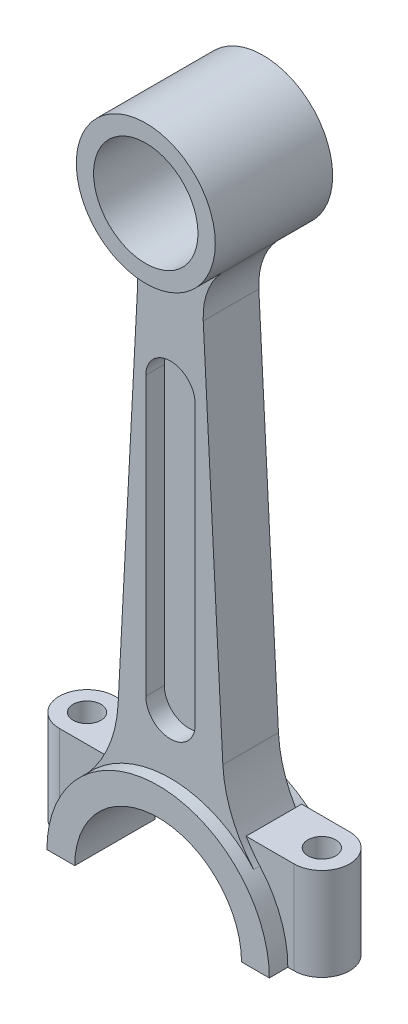
ISO-10303-21;
HEADER;
FILE_DESCRIPTION(('STEP AP214'),'2;1');
FILE_NAME('part.step','',(''),(''),'','','');
FILE_SCHEMA(('AUTOMOTIVE_DESIGN { 1 0 10303 214 1 1 1 1 }'));
ENDSEC;
DATA;
#1=APPLICATION_CONTEXT('core data for automotive mechanical design processes');
#2=APPLICATION_PROTOCOL_DEFINITION('international standard','automotive_design',2000,#1);
#3=PRODUCT_CONTEXT('',#1,'mechanical');
#4=PRODUCT('Part','Part','',(#3));
#5=PRODUCT_RELATED_PRODUCT_CATEGORY('part','',(#4));
#6=PRODUCT_DEFINITION_FORMATION('','',#4);
#7=PRODUCT_DEFINITION_CONTEXT('part definition',#1,'design');
#8=PRODUCT_DEFINITION('design','',#6,#7);
#9=PRODUCT_DEFINITION_SHAPE('','',#8);
#10=(LENGTH_UNIT() NAMED_UNIT(*) SI_UNIT(.MILLI.,.METRE.));
#11=(NAMED_UNIT(*) PLANE_ANGLE_UNIT() SI_UNIT($,.RADIAN.));
#12=(NAMED_UNIT(*) SI_UNIT($,.STERADIAN.) SOLID_ANGLE_UNIT());
#13=UNCERTAINTY_MEASURE_WITH_UNIT(LENGTH_MEASURE(1.E-05),#10,'distance_accuracy_value','');
#14=(GEOMETRIC_REPRESENTATION_CONTEXT(3) GLOBAL_UNCERTAINTY_ASSIGNED_CONTEXT((#13)) GLOBAL_UNIT_ASSIGNED_CONTEXT((#10,
#11,#12)) REPRESENTATION_CONTEXT('',''));
#15=CARTESIAN_POINT('',(0.,0.,0.));
#16=DIRECTION('',(0.,0.,1.));
#17=DIRECTION('',(1.,0.,0.));
#18=AXIS2_PLACEMENT_3D('',#15,#16,#17);
#19=CARTESIAN_POINT('',(0.,55.,-7.));
#20=DIRECTION('',(0.,0.,1.));
#21=DIRECTION('',(1.,0.,0.));
#22=AXIS2_PLACEMENT_3D('',#19,#20,#21);
#23=CYLINDRICAL_SURFACE('',#22,8.);
#24=CARTESIAN_POINT('',(0.,55.,-5.));
#25=DIRECTION('',(0.,0.,1.));
#26=DIRECTION('',(1.,0.,0.));
#27=AXIS2_PLACEMENT_3D('',#24,#25,#26);
#28=CIRCLE('',#27,8.);
#29=CARTESIAN_POINT('',(-7.99999999999999,55.,-5.));
#30=VERTEX_POINT('',#29);
#31=CARTESIAN_POINT('',(8.00000000000001,55.,-5.));
#32=VERTEX_POINT('',#31);
#33=EDGE_CURVE('E55',#30,#32,#28,.T.);
#34=ORIENTED_EDGE('',*,*,#33,.T.);
#35=DIRECTION('',(0.,0.,1.));
#36=VECTOR('',#35,1.);
#37=CARTESIAN_POINT('',(8.00000000000001,55.,-7.));
#38=LINE('',#37,#36);
#39=CARTESIAN_POINT('',(8.00000000000001,55.,-7.));
#40=VERTEX_POINT('',#39);
#41=EDGE_CURVE('E376',#40,#32,#38,.T.);
#42=ORIENTED_EDGE('',*,*,#41,.F.);
#43=CARTESIAN_POINT('',(0.,55.,-7.));
#44=DIRECTION('',(0.,0.,1.));
#45=DIRECTION('',(1.,0.,0.));
#46=AXIS2_PLACEMENT_3D('',#43,#44,#45);
#47=CIRCLE('',#46,8.);
#48=CARTESIAN_POINT('',(-7.99999999999999,55.,-7.));
#49=VERTEX_POINT('',#48);
#50=EDGE_CURVE('E411',#49,#40,#47,.T.);
#51=ORIENTED_EDGE('',*,*,#50,.F.);
#52=DIRECTION('',(0.,0.,1.));
#53=VECTOR('',#52,1.);
#54=CARTESIAN_POINT('',(-7.99999999999999,55.,-7.));
#55=LINE('',#54,#53);
#56=EDGE_CURVE('E269',#49,#30,#55,.T.);
#57=ORIENTED_EDGE('',*,*,#56,.T.);
#58=EDGE_LOOP('',(#34,#42,#51,#57));
#59=FACE_BOUND('',#58,.T.);
#60=ADVANCED_FACE('F40',(#59),#23,.F.);
#61=CARTESIAN_POINT('',(8.00000000000002,0.,-7.));
#62=DIRECTION('',(-1.,0.,0.));
#63=DIRECTION('',(0.,-1.,0.));
#64=AXIS2_PLACEMENT_3D('',#61,#62,#63);
#65=PLANE('',#64);
#66=ORIENTED_EDGE('',*,*,#41,.T.);
#67=DIRECTION('',(0.,-1.,0.));
#68=VECTOR('',#67,1.);
#69=CARTESIAN_POINT('',(8.00000000000002,0.,-5.));
#70=LINE('',#69,#68);
#71=CARTESIAN_POINT('',(8.,145.,-5.));
#72=VERTEX_POINT('',#71);
#73=EDGE_CURVE('E62',#72,#32,#70,.T.);
#74=ORIENTED_EDGE('',*,*,#73,.F.);
#75=DIRECTION('',(0.,0.,1.));
#76=VECTOR('',#75,1.);
#77=CARTESIAN_POINT('',(8.,145.,-7.));
#78=LINE('',#77,#76);
#79=CARTESIAN_POINT('',(8.,145.,-7.));
#80=VERTEX_POINT('',#79);
#81=EDGE_CURVE('E377',#80,#72,#78,.T.);
#82=ORIENTED_EDGE('',*,*,#81,.F.);
#83=DIRECTION('',(0.,-1.,0.));
#84=VECTOR('',#83,1.);
#85=CARTESIAN_POINT('',(8.00000000000002,0.,-7.));
#86=LINE('',#85,#84);
#87=EDGE_CURVE('E354',#80,#40,#86,.T.);
#88=ORIENTED_EDGE('',*,*,#87,.T.);
#89=EDGE_LOOP('',(#66,#74,#82,#88));
#90=FACE_BOUND('',#89,.T.);
#91=ADVANCED_FACE('F422',(#90),#65,.T.);
#92=CARTESIAN_POINT('',(0.,145.,-7.));
#93=DIRECTION('',(0.,0.,1.));
#94=DIRECTION('',(1.,0.,0.));
#95=AXIS2_PLACEMENT_3D('',#92,#93,#94);
#96=CYLINDRICAL_SURFACE('',#95,8.);
#97=CARTESIAN_POINT('',(0.,145.,-5.));
#98=DIRECTION('',(0.,0.,1.));
#99=DIRECTION('',(1.,0.,0.));
#100=AXIS2_PLACEMENT_3D('',#97,#98,#99);
#101=CIRCLE('',#100,8.);
#102=CARTESIAN_POINT('',(-8.,145.,-5.));
#103=VERTEX_POINT('',#102);
#104=EDGE_CURVE('E254',#72,#103,#101,.T.);
#105=ORIENTED_EDGE('',*,*,#104,.T.);
#106=DIRECTION('',(0.,0.,1.));
#107=VECTOR('',#106,1.);
#108=CARTESIAN_POINT('',(-8.,145.,-7.));
#109=LINE('',#108,#107);
#110=CARTESIAN_POINT('',(-8.,145.,-7.));
#111=VERTEX_POINT('',#110);
#112=EDGE_CURVE('E277',#111,#103,#109,.T.);
#113=ORIENTED_EDGE('',*,*,#112,.F.);
#114=CARTESIAN_POINT('',(0.,145.,-7.));
#115=DIRECTION('',(0.,0.,1.));
#116=DIRECTION('',(1.,0.,0.));
#117=AXIS2_PLACEMENT_3D('',#114,#115,#116);
#118=CIRCLE('',#117,8.);
#119=EDGE_CURVE('E359',#80,#111,#118,.T.);
#120=ORIENTED_EDGE('',*,*,#119,.F.);
#121=ORIENTED_EDGE('',*,*,#81,.T.);
#122=EDGE_LOOP('',(#105,#113,#120,#121));
#123=FACE_BOUND('',#122,.T.);
#124=ADVANCED_FACE('F417',(#123),#96,.F.);
#125=CARTESIAN_POINT('',(-7.99999999999999,0.,-7.));
#126=DIRECTION('',(-1.,0.,0.));
#127=DIRECTION('',(0.,-1.,0.));
#128=AXIS2_PLACEMENT_3D('',#125,#126,#127);
#129=PLANE('',#128);
#130=DIRECTION('',(0.,-1.,0.));
#131=VECTOR('',#130,1.);
#132=CARTESIAN_POINT('',(-7.99999999999999,0.,-5.));
#133=LINE('',#132,#131);
#134=EDGE_CURVE('E421',#103,#30,#133,.T.);
#135=ORIENTED_EDGE('',*,*,#134,.T.);
#136=ORIENTED_EDGE('',*,*,#56,.F.);
#137=DIRECTION('',(0.,-1.,0.));
#138=VECTOR('',#137,1.);
#139=CARTESIAN_POINT('',(-7.99999999999999,0.,-7.));
#140=LINE('',#139,#138);
#141=EDGE_CURVE('E413',#111,#49,#140,.T.);
#142=ORIENTED_EDGE('',*,*,#141,.F.);
#143=ORIENTED_EDGE('',*,*,#112,.T.);
#144=EDGE_LOOP('',(#135,#136,#142,#143));
#145=FACE_BOUND('',#144,.T.);
#146=ADVANCED_FACE('F419',(#145),#129,.F.);
#147=CARTESIAN_POINT('',(-38.,30.,0.));
#148=DIRECTION('',(0.,1.,0.));
#149=DIRECTION('',(0.,0.,1.));
#150=AXIS2_PLACEMENT_3D('',#147,#148,#149);
#151=CYLINDRICAL_SURFACE('',#150,9.);
#152=DIRECTION('',(0.,1.,0.));
#153=VECTOR('',#152,1.);
#154=CARTESIAN_POINT('',(-38.,0.,9.));
#155=LINE('',#154,#153);
#156=CARTESIAN_POINT('',(-38.,30.,9.));
#157=VERTEX_POINT('',#156);
#158=CARTESIAN_POINT('',(-38.,0.,9.));
#159=VERTEX_POINT('',#158);
#160=EDGE_CURVE('E302',#157,#159,#155,.F.);
#161=ORIENTED_EDGE('',*,*,#160,.F.);
#162=CARTESIAN_POINT('',(-38.,30.,0.));
#163=DIRECTION('',(0.,1.,0.));
#164=DIRECTION('',(0.,0.,1.));
#165=AXIS2_PLACEMENT_3D('',#162,#163,#164);
#166=CIRCLE('',#165,9.);
#167=CARTESIAN_POINT('',(-38.,30.,-9.));
#168=VERTEX_POINT('',#167);
#169=EDGE_CURVE('E308',#168,#157,#166,.T.);
#170=ORIENTED_EDGE('',*,*,#169,.F.);
#171=DIRECTION('',(0.,-1.,0.));
#172=VECTOR('',#171,1.);
#173=CARTESIAN_POINT('',(-38.,30.,-9.));
#174=LINE('',#173,#172);
#175=CARTESIAN_POINT('',(-38.,0.,-9.));
#176=VERTEX_POINT('',#175);
#177=EDGE_CURVE('E305',#176,#168,#174,.F.);
#178=ORIENTED_EDGE('',*,*,#177,.F.);
#179=CARTESIAN_POINT('',(-38.,0.,0.));
#180=DIRECTION('',(0.,-1.,0.));
#181=DIRECTION('',(0.,0.,-1.));
#182=AXIS2_PLACEMENT_3D('',#179,#180,#181);
#183=CIRCLE('',#182,9.);
#184=EDGE_CURVE('E310',#159,#176,#183,.T.);
#185=ORIENTED_EDGE('',*,*,#184,.F.);
#186=EDGE_LOOP('',(#161,#170,#178,#185));
#187=FACE_BOUND('',#186,.T.);
#188=ADVANCED_FACE('F578',(#187),#151,.T.);
#189=CARTESIAN_POINT('',(38.,30.,0.));
#190=DIRECTION('',(0.,1.,0.));
#191=DIRECTION('',(0.,0.,1.));
#192=AXIS2_PLACEMENT_3D('',#189,#190,#191);
#193=CYLINDRICAL_SURFACE('',#192,9.);
#194=DIRECTION('',(0.,1.,0.));
#195=VECTOR('',#194,1.);
#196=CARTESIAN_POINT('',(38.,0.,-9.));
#197=LINE('',#196,#195);
#198=CARTESIAN_POINT('',(38.,30.,-9.));
#199=VERTEX_POINT('',#198);
#200=CARTESIAN_POINT('',(38.,0.,-9.));
#201=VERTEX_POINT('',#200);
#202=EDGE_CURVE('E286',#199,#201,#197,.F.);
#203=ORIENTED_EDGE('',*,*,#202,.F.);
#204=CARTESIAN_POINT('',(38.,30.,0.));
#205=DIRECTION('',(0.,-1.,0.));
#206=DIRECTION('',(1.,0.,0.));
#207=AXIS2_PLACEMENT_3D('',#204,#205,#206);
#208=CIRCLE('',#207,9.);
#209=CARTESIAN_POINT('',(38.,30.,9.));
#210=VERTEX_POINT('',#209);
#211=EDGE_CURVE('E298',#210,#199,#208,.F.);
#212=ORIENTED_EDGE('',*,*,#211,.F.);
#213=DIRECTION('',(0.,-1.,0.));
#214=VECTOR('',#213,1.);
#215=CARTESIAN_POINT('',(38.,30.,9.));
#216=LINE('',#215,#214);
#217=CARTESIAN_POINT('',(38.,0.,9.));
#218=VERTEX_POINT('',#217);
#219=EDGE_CURVE('E295',#218,#210,#216,.F.);
#220=ORIENTED_EDGE('',*,*,#219,.F.);
#221=CARTESIAN_POINT('',(38.,0.,0.));
#222=DIRECTION('',(0.,-1.,0.));
#223=DIRECTION('',(0.,0.,-1.));
#224=AXIS2_PLACEMENT_3D('',#221,#222,#223);
#225=CIRCLE('',#224,9.);
#226=EDGE_CURVE('E300',#201,#218,#225,.T.);
#227=ORIENTED_EDGE('',*,*,#226,.F.);
#228=EDGE_LOOP('',(#203,#212,#220,#227));
#229=FACE_BOUND('',#228,.T.);
#230=ADVANCED_FACE('F632',(#229),#193,.T.);
#231=CARTESIAN_POINT('',(56.9027580616712,50.379322394956,-7.));
#232=DIRECTION('',(0.,0.,1.));
#233=DIRECTION('',(1.,0.,0.));
#234=AXIS2_PLACEMENT_3D('',#231,#232,#233);
#235=CYLINDRICAL_SURFACE('',#234,40.);
#236=DIRECTION('',(0.,0.,-1.));
#237=VECTOR('',#236,1.);
#238=CARTESIAN_POINT('',(22.4835306048783,30.,9.));
#239=LINE('',#238,#237);
#240=CARTESIAN_POINT('',(22.4835306048783,30.,9.));
#241=VERTEX_POINT('',#240);
#242=CARTESIAN_POINT('',(22.4835306048783,30.,-7.));
#243=VERTEX_POINT('',#242);
#244=EDGE_CURVE('E483',#241,#243,#239,.T.);
#245=ORIENTED_EDGE('',*,*,#244,.T.);
#246=CARTESIAN_POINT('',(56.9027580616712,50.379322394956,-7.));
#247=DIRECTION('',(0.,0.,1.));
#248=DIRECTION('',(1.,0.,0.));
#249=AXIS2_PLACEMENT_3D('',#246,#247,#248);
#250=CIRCLE('',#249,40.);
#251=CARTESIAN_POINT('',(16.9575766714883,48.2858841452382,-7.));
#252=VERTEX_POINT('',#251);
#253=EDGE_CURVE('E365',#252,#243,#250,.T.);
#254=ORIENTED_EDGE('',*,*,#253,.F.);
#255=DIRECTION('',(0.,0.,1.));
#256=VECTOR('',#255,1.);
#257=CARTESIAN_POINT('',(16.9575766714883,48.2858841452382,-7.));
#258=LINE('',#257,#256);
#259=CARTESIAN_POINT('',(16.9575766714883,48.2858841452382,11.));
#260=VERTEX_POINT('',#259);
#261=EDGE_CURVE('E290',#252,#260,#258,.T.);
#262=ORIENTED_EDGE('',*,*,#261,.T.);
#263=CARTESIAN_POINT('',(56.9027580616712,50.379322394956,11.));
#264=DIRECTION('',(0.,0.,1.));
#265=DIRECTION('',(1.,0.,0.));
#266=AXIS2_PLACEMENT_3D('',#263,#264,#265);
#267=CIRCLE('',#266,40.);
#268=CARTESIAN_POINT('',(26.9539380292127,23.8638895555055,11.));
#269=VERTEX_POINT('',#268);
#270=EDGE_CURVE('E405',#260,#269,#267,.T.);
#271=ORIENTED_EDGE('',*,*,#270,.T.);
#272=DIRECTION('',(0.,0.,1.));
#273=VECTOR('',#272,1.);
#274=CARTESIAN_POINT('',(26.9539380292127,23.8638895555055,-7.));
#275=LINE('',#274,#273);
#276=CARTESIAN_POINT('',(26.9539380292127,23.8638895555055,9.));
#277=VERTEX_POINT('',#276);
#278=EDGE_CURVE('E371',#277,#269,#275,.T.);
#279=ORIENTED_EDGE('',*,*,#278,.F.);
#280=CARTESIAN_POINT('',(56.9027580616712,50.379322394956,9.));
#281=DIRECTION('',(0.,0.,1.));
#282=DIRECTION('',(1.,0.,0.));
#283=AXIS2_PLACEMENT_3D('',#280,#281,#282);
#284=CIRCLE('',#283,40.);
#285=EDGE_CURVE('E462',#241,#277,#284,.T.);
#286=ORIENTED_EDGE('',*,*,#285,.F.);
#287=EDGE_LOOP('',(#245,#254,#262,#271,#279,#286));
#288=FACE_BOUND('',#287,.T.);
#289=ADVANCED_FACE('F601',(#288),#235,.F.);
#290=CARTESIAN_POINT('',(0.,0.,-11.));
#291=DIRECTION('',(0.,0.,1.));
#292=DIRECTION('',(1.,0.,0.));
#293=AXIS2_PLACEMENT_3D('',#290,#291,#292);
#294=CYLINDRICAL_SURFACE('',#293,36.);
#295=CARTESIAN_POINT('',(0.,0.,-7.));
#296=DIRECTION('',(0.,0.,1.));
#297=DIRECTION('',(1.,0.,0.));
#298=AXIS2_PLACEMENT_3D('',#295,#296,#297);
#299=CIRCLE('',#298,36.);
#300=CARTESIAN_POINT('',(26.9539380292127,23.8638895555055,-7.));
#301=VERTEX_POINT('',#300);
#302=CARTESIAN_POINT('',(-26.9539380292127,23.8638895555054,-7.));
#303=VERTEX_POINT('',#302);
#304=EDGE_CURVE('E356',#301,#303,#299,.T.);
#305=ORIENTED_EDGE('',*,*,#304,.F.);
#306=DIRECTION('',(0.,0.,-1.));
#307=VECTOR('',#306,1.);
#308=CARTESIAN_POINT('',(26.9539380292127,23.8638895555055,9.));
#309=LINE('',#308,#307);
#310=CARTESIAN_POINT('',(26.9539380292127,23.8638895555055,-9.));
#311=VERTEX_POINT('',#310);
#312=EDGE_CURVE('E471',#301,#311,#309,.T.);
#313=ORIENTED_EDGE('',*,*,#312,.T.);
#314=CARTESIAN_POINT('',(0.,0.,-9.));
#315=DIRECTION('',(0.,0.,1.));
#316=DIRECTION('',(1.,0.,0.));
#317=AXIS2_PLACEMENT_3D('',#314,#315,#316);
#318=CIRCLE('',#317,36.);
#319=CARTESIAN_POINT('',(36.,0.,-9.));
#320=VERTEX_POINT('',#319);
#321=EDGE_CURVE('E475',#320,#311,#318,.T.);
#322=ORIENTED_EDGE('',*,*,#321,.F.);
#323=DIRECTION('',(0.,0.,1.));
#324=VECTOR('',#323,1.);
#325=CARTESIAN_POINT('',(36.,0.,-11.));
#326=LINE('',#325,#324);
#327=CARTESIAN_POINT('',(36.,0.,-11.));
#328=VERTEX_POINT('',#327);
#329=EDGE_CURVE('E542',#328,#320,#326,.T.);
#330=ORIENTED_EDGE('',*,*,#329,.F.);
#331=CARTESIAN_POINT('',(0.,0.,-11.));
#332=DIRECTION('',(0.,0.,1.));
#333=DIRECTION('',(1.,0.,0.));
#334=AXIS2_PLACEMENT_3D('',#331,#332,#333);
#335=CIRCLE('',#334,36.);
#336=CARTESIAN_POINT('',(-36.,0.,-11.));
#337=VERTEX_POINT('',#336);
#338=EDGE_CURVE('E533',#328,#337,#335,.T.);
#339=ORIENTED_EDGE('',*,*,#338,.T.);
#340=DIRECTION('',(0.,0.,1.));
#341=VECTOR('',#340,1.);
#342=CARTESIAN_POINT('',(-36.,0.,-11.));
#343=LINE('',#342,#341);
#344=CARTESIAN_POINT('',(-36.,0.,-9.));
#345=VERTEX_POINT('',#344);
#346=EDGE_CURVE('E539',#337,#345,#343,.T.);
#347=ORIENTED_EDGE('',*,*,#346,.T.);
#348=CARTESIAN_POINT('',(0.,0.,-9.));
#349=DIRECTION('',(0.,0.,1.));
#350=DIRECTION('',(1.,0.,0.));
#351=AXIS2_PLACEMENT_3D('',#348,#349,#350);
#352=CIRCLE('',#351,36.);
#353=CARTESIAN_POINT('',(-26.9539380292127,23.8638895555054,-9.));
#354=VERTEX_POINT('',#353);
#355=EDGE_CURVE('E492',#354,#345,#352,.T.);
#356=ORIENTED_EDGE('',*,*,#355,.F.);
#357=DIRECTION('',(0.,0.,-1.));
#358=VECTOR('',#357,1.);
#359=CARTESIAN_POINT('',(-26.9539380292127,23.8638895555054,9.));
#360=LINE('',#359,#358);
#361=EDGE_CURVE('E500',#303,#354,#360,.T.);
#362=ORIENTED_EDGE('',*,*,#361,.F.);
#363=EDGE_LOOP('',(#305,#313,#322,#330,#339,#347,#356,#362));
#364=FACE_BOUND('',#363,.T.);
#365=ADVANCED_FACE('F585',(#364),#294,.T.);
#366=CARTESIAN_POINT('',(0.,201.2,19.));
#367=DIRECTION('',(0.,0.,-1.));
#368=DIRECTION('',(-1.,0.,0.));
#369=AXIS2_PLACEMENT_3D('',#366,#367,#368);
#370=CYLINDRICAL_SURFACE('',#369,22.5);
#371=CARTESIAN_POINT('',(0.,201.2,-19.));
#372=DIRECTION('',(0.,0.,1.));
#373=DIRECTION('',(1.,0.,0.));
#374=AXIS2_PLACEMENT_3D('',#371,#372,#373);
#375=CIRCLE('',#374,22.5);
#376=CARTESIAN_POINT('',(22.5,201.2,-19.));
#377=VERTEX_POINT('',#376);
#378=EDGE_CURVE('E283',#377,#377,#375,.T.);
#379=ORIENTED_EDGE('',*,*,#378,.T.);
#380=EDGE_LOOP('',(#379));
#381=FACE_BOUND('',#380,.T.);
#382=CARTESIAN_POINT('',(0.,201.2,19.));
#383=DIRECTION('',(0.,0.,1.));
#384=DIRECTION('',(1.,0.,0.));
#385=AXIS2_PLACEMENT_3D('',#382,#383,#384);
#386=CIRCLE('',#385,22.5);
#387=CARTESIAN_POINT('',(22.5,201.2,19.));
#388=VERTEX_POINT('',#387);
#389=EDGE_CURVE('E282',#388,#388,#386,.T.);
#390=ORIENTED_EDGE('',*,*,#389,.F.);
#391=EDGE_LOOP('',(#390));
#392=FACE_BOUND('',#391,.T.);
#393=CARTESIAN_POINT('',(0.,201.2,11.));
#394=DIRECTION('',(0.,0.,1.));
#395=DIRECTION('',(1.,0.,0.));
#396=AXIS2_PLACEMENT_3D('',#393,#394,#395);
#397=CIRCLE('',#396,22.5);
#398=CARTESIAN_POINT('',(-16.5368777609888,185.942815662183,11.));
#399=VERTEX_POINT('',#398);
#400=CARTESIAN_POINT('',(16.5368777609888,185.942815662183,11.));
#401=VERTEX_POINT('',#400);
#402=EDGE_CURVE('E334',#399,#401,#397,.T.);
#403=ORIENTED_EDGE('',*,*,#402,.T.);
#404=DIRECTION('',(0.,0.,-1.));
#405=VECTOR('',#404,1.);
#406=CARTESIAN_POINT('',(16.5368777609888,185.942815662183,19.));
#407=LINE('',#406,#405);
#408=CARTESIAN_POINT('',(16.5368777609888,185.942815662183,-7.));
#409=VERTEX_POINT('',#408);
#410=EDGE_CURVE('E318',#401,#409,#407,.T.);
#411=ORIENTED_EDGE('',*,*,#410,.T.);
#412=CARTESIAN_POINT('',(0.,201.2,-7.));
#413=DIRECTION('',(0.,0.,1.));
#414=DIRECTION('',(1.,0.,0.));
#415=AXIS2_PLACEMENT_3D('',#412,#413,#414);
#416=CIRCLE('',#415,22.5);
#417=CARTESIAN_POINT('',(-16.5368777609888,185.942815662183,-7.));
#418=VERTEX_POINT('',#417);
#419=EDGE_CURVE('E270',#418,#409,#416,.T.);
#420=ORIENTED_EDGE('',*,*,#419,.F.);
#421=DIRECTION('',(0.,0.,-1.));
#422=VECTOR('',#421,1.);
#423=CARTESIAN_POINT('',(-16.5368777609888,185.942815662183,19.));
#424=LINE('',#423,#422);
#425=EDGE_CURVE('E315',#418,#399,#424,.F.);
#426=ORIENTED_EDGE('',*,*,#425,.T.);
#427=EDGE_LOOP('',(#403,#411,#420,#426));
#428=FACE_BOUND('',#427,.T.);
#429=ADVANCED_FACE('F613',(#381,#392,#428),#370,.T.);
#430=CARTESIAN_POINT('',(0.,201.2,19.));
#431=DIRECTION('',(0.,0.,-1.));
#432=DIRECTION('',(-1.,0.,0.));
#433=AXIS2_PLACEMENT_3D('',#430,#431,#432);
#434=CYLINDRICAL_SURFACE('',#433,16.9);
#435=CARTESIAN_POINT('',(0.,201.2,19.));
#436=DIRECTION('',(0.,0.,1.));
#437=DIRECTION('',(1.,0.,0.));
#438=AXIS2_PLACEMENT_3D('',#435,#436,#437);
#439=CIRCLE('',#438,16.9);
#440=CARTESIAN_POINT('',(16.9,201.2,19.));
#441=VERTEX_POINT('',#440);
#442=EDGE_CURVE('E279',#441,#441,#439,.T.);
#443=ORIENTED_EDGE('',*,*,#442,.T.);
#444=EDGE_LOOP('',(#443));
#445=FACE_BOUND('',#444,.T.);
#446=CARTESIAN_POINT('',(0.,201.2,-19.));
#447=DIRECTION('',(0.,0.,1.));
#448=DIRECTION('',(1.,0.,0.));
#449=AXIS2_PLACEMENT_3D('',#446,#447,#448);
#450=CIRCLE('',#449,16.9);
#451=CARTESIAN_POINT('',(16.9,201.2,-19.));
#452=VERTEX_POINT('',#451);
#453=EDGE_CURVE('E287',#452,#452,#450,.T.);
#454=ORIENTED_EDGE('',*,*,#453,.F.);
#455=EDGE_LOOP('',(#454));
#456=FACE_BOUND('',#455,.T.);
#457=ADVANCED_FACE('F615',(#445,#456),#434,.F.);
#458=CARTESIAN_POINT('',(0.,0.,19.));
#459=DIRECTION('',(0.,0.,1.));
#460=DIRECTION('',(1.,0.,0.));
#461=AXIS2_PLACEMENT_3D('',#458,#459,#460);
#462=PLANE('',#461);
#463=ORIENTED_EDGE('',*,*,#442,.F.);
#464=EDGE_LOOP('',(#463));
#465=FACE_BOUND('',#464,.T.);
#466=ORIENTED_EDGE('',*,*,#389,.T.);
#467=EDGE_LOOP('',(#466));
#468=FACE_BOUND('',#467,.T.);
#469=ADVANCED_FACE('F622',(#465,#468),#462,.T.);
#470=CARTESIAN_POINT('',(0.,0.,-19.));
#471=DIRECTION('',(0.,0.,1.));
#472=DIRECTION('',(1.,0.,0.));
#473=AXIS2_PLACEMENT_3D('',#470,#471,#472);
#474=PLANE('',#473);
#475=ORIENTED_EDGE('',*,*,#453,.T.);
#476=EDGE_LOOP('',(#475));
#477=FACE_BOUND('',#476,.T.);
#478=ORIENTED_EDGE('',*,*,#378,.F.);
#479=EDGE_LOOP('',(#478));
#480=FACE_BOUND('',#479,.T.);
#481=ADVANCED_FACE('F628',(#477,#480),#474,.F.);
#482=CARTESIAN_POINT('',(-19.4347536154456,1.01853227789856,-7.));
#483=DIRECTION('',(-0.998629534754574,0.0523359562429438,0.));
#484=DIRECTION('',(-0.0523359562429438,-0.998629534754574,0.));
#485=AXIS2_PLACEMENT_3D('',#482,#483,#484);
#486=PLANE('',#485);
#487=DIRECTION('',(-0.0523359562429438,-0.998629534754574,0.));
#488=VECTOR('',#487,1.);
#489=CARTESIAN_POINT('',(-19.4347536154456,1.01853227789856,11.));
#490=LINE('',#489,#488);
#491=CARTESIAN_POINT('',(-10.6045909899997,169.508072308901,11.));
#492=VERTEX_POINT('',#491);
#493=CARTESIAN_POINT('',(-16.9575766714882,48.2858841452382,11.));
#494=VERTEX_POINT('',#493);
#495=EDGE_CURVE('E332',#492,#494,#490,.T.);
#496=ORIENTED_EDGE('',*,*,#495,.F.);
#497=DIRECTION('',(0.,0.,-1.));
#498=VECTOR('',#497,1.);
#499=CARTESIAN_POINT('',(-10.6045909899997,169.508072308901,-7.));
#500=LINE('',#499,#498);
#501=CARTESIAN_POINT('',(-10.6045909899997,169.508072308901,-7.));
#502=VERTEX_POINT('',#501);
#503=EDGE_CURVE('E321',#492,#502,#500,.T.);
#504=ORIENTED_EDGE('',*,*,#503,.T.);
#505=DIRECTION('',(-0.0523359562429438,-0.998629534754574,0.));
#506=VECTOR('',#505,1.);
#507=CARTESIAN_POINT('',(-19.4347536154456,1.01853227789856,-7.));
#508=LINE('',#507,#506);
#509=CARTESIAN_POINT('',(-16.9575766714882,48.2858841452382,-7.));
#510=VERTEX_POINT('',#509);
#511=EDGE_CURVE('E351',#502,#510,#508,.T.);
#512=ORIENTED_EDGE('',*,*,#511,.T.);
#513=DIRECTION('',(0.,0.,1.));
#514=VECTOR('',#513,1.);
#515=CARTESIAN_POINT('',(-16.9575766714882,48.2858841452382,-7.));
#516=LINE('',#515,#514);
#517=EDGE_CURVE('E342',#510,#494,#516,.T.);
#518=ORIENTED_EDGE('',*,*,#517,.T.);
#519=EDGE_LOOP('',(#496,#504,#512,#518));
#520=FACE_BOUND('',#519,.T.);
#521=ADVANCED_FACE('F339',(#520),#486,.T.);
#522=CARTESIAN_POINT('',(19.4347536154457,1.01853227789857,-7.));
#523=DIRECTION('',(-0.998629534754574,-0.0523359562429444,0.));
#524=DIRECTION('',(0.0523359562429444,-0.998629534754574,0.));
#525=AXIS2_PLACEMENT_3D('',#522,#523,#524);
#526=PLANE('',#525);
#527=DIRECTION('',(0.0523359562429444,-0.998629534754574,0.));
#528=VECTOR('',#527,1.);
#529=CARTESIAN_POINT('',(19.4347536154457,1.01853227789857,-7.));
#530=LINE('',#529,#528);
#531=CARTESIAN_POINT('',(10.6045909899997,169.508072308901,-7.));
#532=VERTEX_POINT('',#531);
#533=EDGE_CURVE('E273',#532,#252,#530,.T.);
#534=ORIENTED_EDGE('',*,*,#533,.F.);
#535=DIRECTION('',(0.,0.,1.));
#536=VECTOR('',#535,1.);
#537=CARTESIAN_POINT('',(10.6045909899997,169.508072308901,11.));
#538=LINE('',#537,#536);
#539=CARTESIAN_POINT('',(10.6045909899997,169.508072308901,11.));
#540=VERTEX_POINT('',#539);
#541=EDGE_CURVE('E312',#532,#540,#538,.T.);
#542=ORIENTED_EDGE('',*,*,#541,.T.);
#543=DIRECTION('',(0.0523359562429444,-0.998629534754574,0.));
#544=VECTOR('',#543,1.);
#545=CARTESIAN_POINT('',(19.4347536154457,1.01853227789857,11.));
#546=LINE('',#545,#544);
#547=EDGE_CURVE('E408',#540,#260,#546,.T.);
#548=ORIENTED_EDGE('',*,*,#547,.T.);
#549=ORIENTED_EDGE('',*,*,#261,.F.);
#550=EDGE_LOOP('',(#534,#542,#548,#549));
#551=FACE_BOUND('',#550,.T.);
#552=ADVANCED_FACE('F439',(#551),#526,.F.);
#553=CARTESIAN_POINT('',(8.00000000000001,55.,5.));
#554=VERTEX_POINT('',#553);
#555=CARTESIAN_POINT('',(8.00000000000001,55.,11.));
#556=VERTEX_POINT('',#555);
#557=EDGE_CURVE('E262',#554,#556,#38,.T.);
#558=ORIENTED_EDGE('',*,*,#557,.F.);
#559=CARTESIAN_POINT('',(0.,55.,5.));
#560=DIRECTION('',(0.,0.,1.));
#561=DIRECTION('',(1.,0.,0.));
#562=AXIS2_PLACEMENT_3D('',#559,#560,#561);
#563=CIRCLE('',#562,8.);
#564=CARTESIAN_POINT('',(-7.99999999999999,55.,5.));
#565=VERTEX_POINT('',#564);
#566=EDGE_CURVE('E247',#565,#554,#563,.T.);
#567=ORIENTED_EDGE('',*,*,#566,.F.);
#568=CARTESIAN_POINT('',(-7.99999999999999,55.,11.));
#569=VERTEX_POINT('',#568);
#570=EDGE_CURVE('E260',#565,#569,#55,.T.);
#571=ORIENTED_EDGE('',*,*,#570,.T.);
#572=CARTESIAN_POINT('',(0.,55.,11.));
#573=DIRECTION('',(0.,0.,1.));
#574=DIRECTION('',(1.,0.,0.));
#575=AXIS2_PLACEMENT_3D('',#572,#573,#574);
#576=CIRCLE('',#575,8.);
#577=EDGE_CURVE('E394',#569,#556,#576,.T.);
#578=ORIENTED_EDGE('',*,*,#577,.T.);
#579=EDGE_LOOP('',(#558,#567,#571,#578));
#580=FACE_BOUND('',#579,.T.);
#581=ADVANCED_FACE('F258',(#580),#23,.F.);
#582=DIRECTION('',(0.,-1.,0.));
#583=VECTOR('',#582,1.);
#584=CARTESIAN_POINT('',(8.00000000000002,0.,5.));
#585=LINE('',#584,#583);
#586=CARTESIAN_POINT('',(8.,145.,5.));
#587=VERTEX_POINT('',#586);
#588=EDGE_CURVE('E263',#587,#554,#585,.T.);
#589=ORIENTED_EDGE('',*,*,#588,.T.);
#590=ORIENTED_EDGE('',*,*,#557,.T.);
#591=DIRECTION('',(0.,-1.,0.));
#592=VECTOR('',#591,1.);
#593=CARTESIAN_POINT('',(8.00000000000002,0.,11.));
#594=LINE('',#593,#592);
#595=CARTESIAN_POINT('',(8.,145.,11.));
#596=VERTEX_POINT('',#595);
#597=EDGE_CURVE('E345',#596,#556,#594,.T.);
#598=ORIENTED_EDGE('',*,*,#597,.F.);
#599=EDGE_CURVE('E378',#587,#596,#78,.T.);
#600=ORIENTED_EDGE('',*,*,#599,.F.);
#601=EDGE_LOOP('',(#589,#590,#598,#600));
#602=FACE_BOUND('',#601,.T.);
#603=ADVANCED_FACE('F425',(#602),#65,.T.);
#604=CARTESIAN_POINT('',(-8.,145.,5.));
#605=VERTEX_POINT('',#604);
#606=CARTESIAN_POINT('',(-8.,145.,11.));
#607=VERTEX_POINT('',#606);
#608=EDGE_CURVE('E272',#605,#607,#109,.T.);
#609=ORIENTED_EDGE('',*,*,#608,.F.);
#610=CARTESIAN_POINT('',(0.,145.,5.));
#611=DIRECTION('',(0.,0.,1.));
#612=DIRECTION('',(1.,0.,0.));
#613=AXIS2_PLACEMENT_3D('',#610,#611,#612);
#614=CIRCLE('',#613,8.);
#615=EDGE_CURVE('E250',#587,#605,#614,.T.);
#616=ORIENTED_EDGE('',*,*,#615,.F.);
#617=ORIENTED_EDGE('',*,*,#599,.T.);
#618=CARTESIAN_POINT('',(0.,145.,11.));
#619=DIRECTION('',(0.,0.,1.));
#620=DIRECTION('',(1.,0.,0.));
#621=AXIS2_PLACEMENT_3D('',#618,#619,#620);
#622=CIRCLE('',#621,8.);
#623=EDGE_CURVE('E393',#596,#607,#622,.T.);
#624=ORIENTED_EDGE('',*,*,#623,.T.);
#625=EDGE_LOOP('',(#609,#616,#617,#624));
#626=FACE_BOUND('',#625,.T.);
#627=ADVANCED_FACE('F396',(#626),#96,.F.);
#628=ORIENTED_EDGE('',*,*,#570,.F.);
#629=DIRECTION('',(0.,-1.,0.));
#630=VECTOR('',#629,1.);
#631=CARTESIAN_POINT('',(-7.99999999999999,0.,5.));
#632=LINE('',#631,#630);
#633=EDGE_CURVE('E244',#605,#565,#632,.T.);
#634=ORIENTED_EDGE('',*,*,#633,.F.);
#635=ORIENTED_EDGE('',*,*,#608,.T.);
#636=DIRECTION('',(0.,-1.,0.));
#637=VECTOR('',#636,1.);
#638=CARTESIAN_POINT('',(-7.99999999999999,0.,11.));
#639=LINE('',#638,#637);
#640=EDGE_CURVE('E268',#607,#569,#639,.T.);
#641=ORIENTED_EDGE('',*,*,#640,.T.);
#642=EDGE_LOOP('',(#628,#634,#635,#641));
#643=FACE_BOUND('',#642,.T.);
#644=ADVANCED_FACE('F266',(#643),#129,.F.);
#645=CARTESIAN_POINT('',(-56.9027580616712,50.379322394956,-7.));
#646=DIRECTION('',(0.,0.,1.));
#647=DIRECTION('',(1.,0.,0.));
#648=AXIS2_PLACEMENT_3D('',#645,#646,#647);
#649=CYLINDRICAL_SURFACE('',#648,40.);
#650=DIRECTION('',(0.,0.,-1.));
#651=VECTOR('',#650,1.);
#652=CARTESIAN_POINT('',(-22.4835306048783,30.,9.));
#653=LINE('',#652,#651);
#654=CARTESIAN_POINT('',(-22.4835306048783,30.,9.));
#655=VERTEX_POINT('',#654);
#656=CARTESIAN_POINT('',(-22.4835306048783,30.,-7.));
#657=VERTEX_POINT('',#656);
#658=EDGE_CURVE('E513',#655,#657,#653,.T.);
#659=ORIENTED_EDGE('',*,*,#658,.F.);
#660=CARTESIAN_POINT('',(-56.9027580616712,50.379322394956,9.));
#661=DIRECTION('',(0.,0.,1.));
#662=DIRECTION('',(1.,0.,0.));
#663=AXIS2_PLACEMENT_3D('',#660,#661,#662);
#664=CIRCLE('',#663,40.);
#665=CARTESIAN_POINT('',(-26.9539380292127,23.8638895555054,9.));
#666=VERTEX_POINT('',#665);
#667=EDGE_CURVE('E489',#655,#666,#664,.F.);
#668=ORIENTED_EDGE('',*,*,#667,.T.);
#669=DIRECTION('',(0.,0.,1.));
#670=VECTOR('',#669,1.);
#671=CARTESIAN_POINT('',(-26.9539380292127,23.8638895555054,-7.));
#672=LINE('',#671,#670);
#673=CARTESIAN_POINT('',(-26.9539380292127,23.8638895555054,11.));
#674=VERTEX_POINT('',#673);
#675=EDGE_CURVE('E373',#666,#674,#672,.T.);
#676=ORIENTED_EDGE('',*,*,#675,.T.);
#677=CARTESIAN_POINT('',(-56.9027580616712,50.379322394956,11.));
#678=DIRECTION('',(0.,0.,1.));
#679=DIRECTION('',(1.,0.,0.));
#680=AXIS2_PLACEMENT_3D('',#677,#678,#679);
#681=CIRCLE('',#680,40.);
#682=EDGE_CURVE('E344',#494,#674,#681,.F.);
#683=ORIENTED_EDGE('',*,*,#682,.F.);
#684=ORIENTED_EDGE('',*,*,#517,.F.);
#685=CARTESIAN_POINT('',(-56.9027580616712,50.379322394956,-7.));
#686=DIRECTION('',(0.,0.,1.));
#687=DIRECTION('',(1.,0.,0.));
#688=AXIS2_PLACEMENT_3D('',#685,#686,#687);
#689=CIRCLE('',#688,40.);
#690=EDGE_CURVE('E353',#510,#657,#689,.F.);
#691=ORIENTED_EDGE('',*,*,#690,.T.);
#692=EDGE_LOOP('',(#659,#668,#676,#683,#684,#691));
#693=FACE_BOUND('',#692,.T.);
#694=ADVANCED_FACE('F594',(#693),#649,.F.);
#695=CARTESIAN_POINT('',(0.,0.,-7.));
#696=DIRECTION('',(0.,0.,1.));
#697=DIRECTION('',(1.,0.,0.));
#698=AXIS2_PLACEMENT_3D('',#695,#696,#697);
#699=PLANE('',#698);
#700=ORIENTED_EDGE('',*,*,#50,.T.);
#701=ORIENTED_EDGE('',*,*,#87,.F.);
#702=ORIENTED_EDGE('',*,*,#119,.T.);
#703=ORIENTED_EDGE('',*,*,#141,.T.);
#704=EDGE_LOOP('',(#700,#701,#702,#703));
#705=FACE_BOUND('',#704,.T.);
#706=ORIENTED_EDGE('',*,*,#511,.F.);
#707=CARTESIAN_POINT('',(-33.0737555219776,170.685631324367,-7.));
#708=DIRECTION('',(0.,0.,1.));
#709=DIRECTION('',(1.,0.,0.));
#710=AXIS2_PLACEMENT_3D('',#707,#708,#709);
#711=CIRCLE('',#710,22.5);
#712=EDGE_CURVE('E11',#502,#418,#711,.T.);
#713=ORIENTED_EDGE('',*,*,#712,.T.);
#714=ORIENTED_EDGE('',*,*,#419,.T.);
#715=CARTESIAN_POINT('',(33.0737555219776,170.685631324367,-7.));
#716=DIRECTION('',(0.,0.,1.));
#717=DIRECTION('',(1.,0.,0.));
#718=AXIS2_PLACEMENT_3D('',#715,#716,#717);
#719=CIRCLE('',#718,22.5);
#720=EDGE_CURVE('E326',#409,#532,#719,.T.);
#721=ORIENTED_EDGE('',*,*,#720,.T.);
#722=ORIENTED_EDGE('',*,*,#533,.T.);
#723=ORIENTED_EDGE('',*,*,#253,.T.);
#724=CARTESIAN_POINT('',(56.9027580616712,50.379322394956,-7.));
#725=DIRECTION('',(0.,0.,1.));
#726=DIRECTION('',(1.,0.,0.));
#727=AXIS2_PLACEMENT_3D('',#724,#725,#726);
#728=CIRCLE('',#727,40.);
#729=EDGE_CURVE('E486',#301,#243,#728,.F.);
#730=ORIENTED_EDGE('',*,*,#729,.F.);
#731=ORIENTED_EDGE('',*,*,#304,.T.);
#732=CARTESIAN_POINT('',(-56.9027580616712,50.379322394956,-7.));
#733=DIRECTION('',(0.,0.,1.));
#734=DIRECTION('',(1.,0.,0.));
#735=AXIS2_PLACEMENT_3D('',#732,#733,#734);
#736=CIRCLE('',#735,40.);
#737=EDGE_CURVE('E516',#303,#657,#736,.T.);
#738=ORIENTED_EDGE('',*,*,#737,.T.);
#739=ORIENTED_EDGE('',*,*,#690,.F.);
#740=EDGE_LOOP('',(#706,#713,#714,#721,#722,#723,#730,#731,#738,#739));
#741=FACE_BOUND('',#740,.T.);
#742=ADVANCED_FACE('F349',(#705,#741),#699,.F.);
#743=CARTESIAN_POINT('',(0.,0.,11.));
#744=DIRECTION('',(0.,0.,1.));
#745=DIRECTION('',(1.,0.,0.));
#746=AXIS2_PLACEMENT_3D('',#743,#744,#745);
#747=PLANE('',#746);
#748=ORIENTED_EDGE('',*,*,#577,.F.);
#749=ORIENTED_EDGE('',*,*,#640,.F.);
#750=ORIENTED_EDGE('',*,*,#623,.F.);
#751=ORIENTED_EDGE('',*,*,#597,.T.);
#752=EDGE_LOOP('',(#748,#749,#750,#751));
#753=FACE_BOUND('',#752,.T.);
#754=ORIENTED_EDGE('',*,*,#402,.F.);
#755=CARTESIAN_POINT('',(-33.0737555219776,170.685631324367,11.));
#756=DIRECTION('',(0.,0.,1.));
#757=DIRECTION('',(1.,0.,0.));
#758=AXIS2_PLACEMENT_3D('',#755,#756,#757);
#759=CIRCLE('',#758,22.5);
#760=EDGE_CURVE('E48',#399,#492,#759,.F.);
#761=ORIENTED_EDGE('',*,*,#760,.T.);
#762=ORIENTED_EDGE('',*,*,#495,.T.);
#763=ORIENTED_EDGE('',*,*,#682,.T.);
#764=CARTESIAN_POINT('',(0.,0.,11.));
#765=DIRECTION('',(0.,0.,1.));
#766=DIRECTION('',(1.,0.,0.));
#767=AXIS2_PLACEMENT_3D('',#764,#765,#766);
#768=CIRCLE('',#767,36.);
#769=EDGE_CURVE('E402',#269,#674,#768,.T.);
#770=ORIENTED_EDGE('',*,*,#769,.F.);
#771=ORIENTED_EDGE('',*,*,#270,.F.);
#772=ORIENTED_EDGE('',*,*,#547,.F.);
#773=CARTESIAN_POINT('',(33.0737555219776,170.685631324367,11.));
#774=DIRECTION('',(0.,0.,1.));
#775=DIRECTION('',(1.,0.,0.));
#776=AXIS2_PLACEMENT_3D('',#773,#774,#775);
#777=CIRCLE('',#776,22.5);
#778=EDGE_CURVE('E323',#540,#401,#777,.F.);
#779=ORIENTED_EDGE('',*,*,#778,.T.);
#780=EDGE_LOOP('',(#754,#761,#762,#763,#770,#771,#772,#779));
#781=FACE_BOUND('',#780,.T.);
#782=ADVANCED_FACE('F330',(#753,#781),#747,.T.);
#783=CARTESIAN_POINT('',(0.,0.,9.));
#784=DIRECTION('',(0.,0.,1.));
#785=DIRECTION('',(1.,0.,0.));
#786=AXIS2_PLACEMENT_3D('',#783,#784,#785);
#787=CIRCLE('',#786,36.);
#788=CARTESIAN_POINT('',(36.,0.,9.));
#789=VERTEX_POINT('',#788);
#790=EDGE_CURVE('E465',#789,#277,#787,.T.);
#791=ORIENTED_EDGE('',*,*,#790,.T.);
#792=ORIENTED_EDGE('',*,*,#278,.T.);
#793=ORIENTED_EDGE('',*,*,#769,.T.);
#794=ORIENTED_EDGE('',*,*,#675,.F.);
#795=CARTESIAN_POINT('',(0.,0.,9.));
#796=DIRECTION('',(0.,0.,1.));
#797=DIRECTION('',(1.,0.,0.));
#798=AXIS2_PLACEMENT_3D('',#795,#796,#797);
#799=CIRCLE('',#798,36.);
#800=CARTESIAN_POINT('',(-36.,0.,9.));
#801=VERTEX_POINT('',#800);
#802=EDGE_CURVE('E497',#666,#801,#799,.T.);
#803=ORIENTED_EDGE('',*,*,#802,.T.);
#804=CARTESIAN_POINT('',(-36.,0.,15.));
#805=VERTEX_POINT('',#804);
#806=EDGE_CURVE('E541',#801,#805,#343,.T.);
#807=ORIENTED_EDGE('',*,*,#806,.T.);
#808=CARTESIAN_POINT('',(0.,0.,15.));
#809=DIRECTION('',(0.,0.,1.));
#810=DIRECTION('',(1.,0.,0.));
#811=AXIS2_PLACEMENT_3D('',#808,#809,#810);
#812=CIRCLE('',#811,36.);
#813=CARTESIAN_POINT('',(36.,0.,15.));
#814=VERTEX_POINT('',#813);
#815=EDGE_CURVE('E524',#814,#805,#812,.T.);
#816=ORIENTED_EDGE('',*,*,#815,.F.);
#817=EDGE_CURVE('E545',#789,#814,#326,.T.);
#818=ORIENTED_EDGE('',*,*,#817,.F.);
#819=EDGE_LOOP('',(#791,#792,#793,#794,#803,#807,#816,#818));
#820=FACE_BOUND('',#819,.T.);
#821=ADVANCED_FACE('F571',(#820),#294,.T.);
#822=CARTESIAN_POINT('',(0.,0.,-11.));
#823=DIRECTION('',(0.,0.,1.));
#824=DIRECTION('',(1.,0.,0.));
#825=AXIS2_PLACEMENT_3D('',#822,#823,#824);
#826=CYLINDRICAL_SURFACE('',#825,27.);
#827=DIRECTION('',(0.,0.,1.));
#828=VECTOR('',#827,1.);
#829=CARTESIAN_POINT('',(27.,0.,-11.));
#830=LINE('',#829,#828);
#831=CARTESIAN_POINT('',(27.,0.,-11.));
#832=VERTEX_POINT('',#831);
#833=CARTESIAN_POINT('',(27.,0.,15.));
#834=VERTEX_POINT('',#833);
#835=EDGE_CURVE('E546',#832,#834,#830,.T.);
#836=ORIENTED_EDGE('',*,*,#835,.T.);
#837=CARTESIAN_POINT('',(0.,0.,15.));
#838=DIRECTION('',(0.,0.,1.));
#839=DIRECTION('',(1.,0.,0.));
#840=AXIS2_PLACEMENT_3D('',#837,#838,#839);
#841=CIRCLE('',#840,27.);
#842=CARTESIAN_POINT('',(-27.,0.,15.));
#843=VERTEX_POINT('',#842);
#844=EDGE_CURVE('E518',#834,#843,#841,.T.);
#845=ORIENTED_EDGE('',*,*,#844,.T.);
#846=DIRECTION('',(0.,0.,1.));
#847=VECTOR('',#846,1.);
#848=CARTESIAN_POINT('',(-27.,0.,-11.));
#849=LINE('',#848,#847);
#850=CARTESIAN_POINT('',(-27.,0.,-11.));
#851=VERTEX_POINT('',#850);
#852=EDGE_CURVE('E537',#851,#843,#849,.T.);
#853=ORIENTED_EDGE('',*,*,#852,.F.);
#854=CARTESIAN_POINT('',(0.,0.,-11.));
#855=DIRECTION('',(0.,0.,1.));
#856=DIRECTION('',(1.,0.,0.));
#857=AXIS2_PLACEMENT_3D('',#854,#855,#856);
#858=CIRCLE('',#857,27.);
#859=EDGE_CURVE('E528',#832,#851,#858,.T.);
#860=ORIENTED_EDGE('',*,*,#859,.F.);
#861=EDGE_LOOP('',(#836,#845,#853,#860));
#862=FACE_BOUND('',#861,.T.);
#863=ADVANCED_FACE('F562',(#862),#826,.F.);
#864=CARTESIAN_POINT('',(0.,0.,-11.));
#865=DIRECTION('',(0.,-1.,0.));
#866=DIRECTION('',(0.,0.,-1.));
#867=AXIS2_PLACEMENT_3D('',#864,#865,#866);
#868=PLANE('',#867);
#869=CARTESIAN_POINT('',(-38.,0.,0.));
#870=DIRECTION('',(0.,-1.,0.));
#871=DIRECTION('',(0.,0.,-1.));
#872=AXIS2_PLACEMENT_3D('',#869,#870,#871);
#873=CIRCLE('',#872,4.5);
#874=CARTESIAN_POINT('',(-38.,0.,-4.5));
#875=VERTEX_POINT('',#874);
#876=EDGE_CURVE('E456',#875,#875,#873,.T.);
#877=ORIENTED_EDGE('',*,*,#876,.F.);
#878=EDGE_LOOP('',(#877));
#879=FACE_BOUND('',#878,.T.);
#880=DIRECTION('',(-1.,0.,0.));
#881=VECTOR('',#880,1.);
#882=CARTESIAN_POINT('',(0.,0.,9.));
#883=LINE('',#882,#881);
#884=EDGE_CURVE('E494',#801,#159,#883,.T.);
#885=ORIENTED_EDGE('',*,*,#884,.T.);
#886=ORIENTED_EDGE('',*,*,#184,.T.);
#887=DIRECTION('',(-1.,0.,0.));
#888=VECTOR('',#887,1.);
#889=CARTESIAN_POINT('',(0.,0.,-9.));
#890=LINE('',#889,#888);
#891=EDGE_CURVE('E505',#345,#176,#890,.T.);
#892=ORIENTED_EDGE('',*,*,#891,.F.);
#893=ORIENTED_EDGE('',*,*,#346,.F.);
#894=DIRECTION('',(1.,0.,0.));
#895=VECTOR('',#894,1.);
#896=CARTESIAN_POINT('',(0.,0.,-11.));
#897=LINE('',#896,#895);
#898=EDGE_CURVE('E534',#337,#851,#897,.T.);
#899=ORIENTED_EDGE('',*,*,#898,.T.);
#900=ORIENTED_EDGE('',*,*,#852,.T.);
#901=DIRECTION('',(1.,0.,0.));
#902=VECTOR('',#901,1.);
#903=CARTESIAN_POINT('',(0.,0.,15.));
#904=LINE('',#903,#902);
#905=EDGE_CURVE('E525',#805,#843,#904,.T.);
#906=ORIENTED_EDGE('',*,*,#905,.F.);
#907=ORIENTED_EDGE('',*,*,#806,.F.);
#908=EDGE_LOOP('',(#885,#886,#892,#893,#899,#900,#906,#907));
#909=FACE_BOUND('',#908,.T.);
#910=ADVANCED_FACE('F553',(#879,#909),#868,.T.);
#911=CARTESIAN_POINT('',(38.,0.,0.));
#912=DIRECTION('',(0.,-1.,0.));
#913=DIRECTION('',(0.,0.,-1.));
#914=AXIS2_PLACEMENT_3D('',#911,#912,#913);
#915=CIRCLE('',#914,4.5);
#916=CARTESIAN_POINT('',(38.,0.,-4.5));
#917=VERTEX_POINT('',#916);
#918=EDGE_CURVE('E451',#917,#917,#915,.T.);
#919=ORIENTED_EDGE('',*,*,#918,.F.);
#920=EDGE_LOOP('',(#919));
#921=FACE_BOUND('',#920,.T.);
#922=DIRECTION('',(1.,0.,0.));
#923=VECTOR('',#922,1.);
#924=CARTESIAN_POINT('',(0.,0.,-9.));
#925=LINE('',#924,#923);
#926=EDGE_CURVE('E463',#320,#201,#925,.T.);
#927=ORIENTED_EDGE('',*,*,#926,.T.);
#928=ORIENTED_EDGE('',*,*,#226,.T.);
#929=DIRECTION('',(1.,0.,0.));
#930=VECTOR('',#929,1.);
#931=CARTESIAN_POINT('',(0.,0.,9.));
#932=LINE('',#931,#930);
#933=EDGE_CURVE('E468',#789,#218,#932,.T.);
#934=ORIENTED_EDGE('',*,*,#933,.F.);
#935=ORIENTED_EDGE('',*,*,#817,.T.);
#936=EDGE_CURVE('E521',#834,#814,#904,.T.);
#937=ORIENTED_EDGE('',*,*,#936,.F.);
#938=ORIENTED_EDGE('',*,*,#835,.F.);
#939=EDGE_CURVE('E530',#832,#328,#897,.T.);
#940=ORIENTED_EDGE('',*,*,#939,.T.);
#941=ORIENTED_EDGE('',*,*,#329,.T.);
#942=EDGE_LOOP('',(#927,#928,#934,#935,#937,#938,#940,#941));
#943=FACE_BOUND('',#942,.T.);
#944=ADVANCED_FACE('F690',(#921,#943),#868,.T.);
#945=CARTESIAN_POINT('',(0.,0.,-11.));
#946=DIRECTION('',(0.,0.,1.));
#947=DIRECTION('',(1.,0.,0.));
#948=AXIS2_PLACEMENT_3D('',#945,#946,#947);
#949=PLANE('',#948);
#950=ORIENTED_EDGE('',*,*,#859,.T.);
#951=ORIENTED_EDGE('',*,*,#898,.F.);
#952=ORIENTED_EDGE('',*,*,#338,.F.);
#953=ORIENTED_EDGE('',*,*,#939,.F.);
#954=EDGE_LOOP('',(#950,#951,#952,#953));
#955=FACE_BOUND('',#954,.T.);
#956=ADVANCED_FACE('F560',(#955),#949,.F.);
#957=CARTESIAN_POINT('',(0.,0.,15.));
#958=DIRECTION('',(0.,0.,1.));
#959=DIRECTION('',(1.,0.,0.));
#960=AXIS2_PLACEMENT_3D('',#957,#958,#959);
#961=PLANE('',#960);
#962=ORIENTED_EDGE('',*,*,#844,.F.);
#963=ORIENTED_EDGE('',*,*,#936,.T.);
#964=ORIENTED_EDGE('',*,*,#815,.T.);
#965=ORIENTED_EDGE('',*,*,#905,.T.);
#966=EDGE_LOOP('',(#962,#963,#964,#965));
#967=FACE_BOUND('',#966,.T.);
#968=ADVANCED_FACE('F565',(#967),#961,.T.);
#969=CARTESIAN_POINT('',(-56.9027580616712,50.379322394956,9.));
#970=DIRECTION('',(0.,0.,-1.));
#971=DIRECTION('',(-1.,0.,0.));
#972=AXIS2_PLACEMENT_3D('',#969,#970,#971);
#973=CYLINDRICAL_SURFACE('',#972,40.);
#974=ORIENTED_EDGE('',*,*,#737,.F.);
#975=ORIENTED_EDGE('',*,*,#361,.T.);
#976=CARTESIAN_POINT('',(-56.9027580616712,50.379322394956,-9.));
#977=DIRECTION('',(0.,0.,1.));
#978=DIRECTION('',(1.,0.,0.));
#979=AXIS2_PLACEMENT_3D('',#976,#977,#978);
#980=CIRCLE('',#979,40.);
#981=CARTESIAN_POINT('',(-22.4835306048783,30.,-9.));
#982=VERTEX_POINT('',#981);
#983=EDGE_CURVE('E488',#982,#354,#980,.F.);
#984=ORIENTED_EDGE('',*,*,#983,.F.);
#985=EDGE_CURVE('E512',#657,#982,#653,.T.);
#986=ORIENTED_EDGE('',*,*,#985,.F.);
#987=EDGE_LOOP('',(#974,#975,#984,#986));
#988=FACE_BOUND('',#987,.T.);
#989=ADVANCED_FACE('F588',(#988),#973,.T.);
#990=CARTESIAN_POINT('',(0.,30.,9.));
#991=DIRECTION('',(0.,1.,0.));
#992=DIRECTION('',(0.,0.,1.));
#993=AXIS2_PLACEMENT_3D('',#990,#991,#992);
#994=PLANE('',#993);
#995=CARTESIAN_POINT('',(-38.,30.,0.));
#996=DIRECTION('',(0.,1.,0.));
#997=DIRECTION('',(0.,0.,1.));
#998=AXIS2_PLACEMENT_3D('',#995,#996,#997);
#999=CIRCLE('',#998,4.5);
#1000=CARTESIAN_POINT('',(-38.,30.,4.5));
#1001=VERTEX_POINT('',#1000);
#1002=EDGE_CURVE('E441',#1001,#1001,#999,.T.);
#1003=ORIENTED_EDGE('',*,*,#1002,.F.);
#1004=EDGE_LOOP('',(#1003));
#1005=FACE_BOUND('',#1004,.T.);
#1006=DIRECTION('',(1.,0.,0.));
#1007=VECTOR('',#1006,1.);
#1008=CARTESIAN_POINT('',(0.,30.,-9.));
#1009=LINE('',#1008,#1007);
#1010=EDGE_CURVE('E503',#168,#982,#1009,.T.);
#1011=ORIENTED_EDGE('',*,*,#1010,.F.);
#1012=ORIENTED_EDGE('',*,*,#169,.T.);
#1013=DIRECTION('',(1.,0.,0.));
#1014=VECTOR('',#1013,1.);
#1015=CARTESIAN_POINT('',(0.,30.,9.));
#1016=LINE('',#1015,#1014);
#1017=EDGE_CURVE('E491',#157,#655,#1016,.T.);
#1018=ORIENTED_EDGE('',*,*,#1017,.T.);
#1019=ORIENTED_EDGE('',*,*,#658,.T.);
#1020=ORIENTED_EDGE('',*,*,#985,.T.);
#1021=EDGE_LOOP('',(#1011,#1012,#1018,#1019,#1020));
#1022=FACE_BOUND('',#1021,.T.);
#1023=ADVANCED_FACE('F678',(#1005,#1022),#994,.T.);
#1024=CARTESIAN_POINT('',(0.,0.,9.));
#1025=DIRECTION('',(0.,0.,1.));
#1026=DIRECTION('',(1.,0.,0.));
#1027=AXIS2_PLACEMENT_3D('',#1024,#1025,#1026);
#1028=PLANE('',#1027);
#1029=ORIENTED_EDGE('',*,*,#1017,.F.);
#1030=ORIENTED_EDGE('',*,*,#160,.T.);
#1031=ORIENTED_EDGE('',*,*,#884,.F.);
#1032=ORIENTED_EDGE('',*,*,#802,.F.);
#1033=ORIENTED_EDGE('',*,*,#667,.F.);
#1034=EDGE_LOOP('',(#1029,#1030,#1031,#1032,#1033));
#1035=FACE_BOUND('',#1034,.T.);
#1036=ADVANCED_FACE('F575',(#1035),#1028,.T.);
#1037=CARTESIAN_POINT('',(0.,0.,-9.));
#1038=DIRECTION('',(0.,0.,1.));
#1039=DIRECTION('',(1.,0.,0.));
#1040=AXIS2_PLACEMENT_3D('',#1037,#1038,#1039);
#1041=PLANE('',#1040);
#1042=ORIENTED_EDGE('',*,*,#891,.T.);
#1043=ORIENTED_EDGE('',*,*,#177,.T.);
#1044=ORIENTED_EDGE('',*,*,#1010,.T.);
#1045=ORIENTED_EDGE('',*,*,#983,.T.);
#1046=ORIENTED_EDGE('',*,*,#355,.T.);
#1047=EDGE_LOOP('',(#1042,#1043,#1044,#1045,#1046));
#1048=FACE_BOUND('',#1047,.T.);
#1049=ADVANCED_FACE('F581',(#1048),#1041,.F.);
#1050=CARTESIAN_POINT('',(56.9027580616712,50.379322394956,9.));
#1051=DIRECTION('',(0.,0.,-1.));
#1052=DIRECTION('',(-1.,0.,0.));
#1053=AXIS2_PLACEMENT_3D('',#1050,#1051,#1052);
#1054=CYLINDRICAL_SURFACE('',#1053,40.);
#1055=ORIENTED_EDGE('',*,*,#312,.F.);
#1056=ORIENTED_EDGE('',*,*,#729,.T.);
#1057=CARTESIAN_POINT('',(22.4835306048783,30.,-9.));
#1058=VERTEX_POINT('',#1057);
#1059=EDGE_CURVE('E482',#243,#1058,#239,.T.);
#1060=ORIENTED_EDGE('',*,*,#1059,.T.);
#1061=CARTESIAN_POINT('',(56.9027580616712,50.379322394956,-9.));
#1062=DIRECTION('',(0.,0.,1.));
#1063=DIRECTION('',(1.,0.,0.));
#1064=AXIS2_PLACEMENT_3D('',#1061,#1062,#1063);
#1065=CIRCLE('',#1064,40.);
#1066=EDGE_CURVE('E473',#1058,#311,#1065,.T.);
#1067=ORIENTED_EDGE('',*,*,#1066,.T.);
#1068=EDGE_LOOP('',(#1055,#1056,#1060,#1067));
#1069=FACE_BOUND('',#1068,.T.);
#1070=ADVANCED_FACE('F669',(#1069),#1054,.T.);
#1071=CARTESIAN_POINT('',(0.,30.,9.));
#1072=DIRECTION('',(0.,-1.,0.));
#1073=DIRECTION('',(1.,0.,0.));
#1074=AXIS2_PLACEMENT_3D('',#1071,#1072,#1073);
#1075=PLANE('',#1074);
#1076=CARTESIAN_POINT('',(38.,30.,0.));
#1077=DIRECTION('',(0.,1.,0.));
#1078=DIRECTION('',(0.,0.,1.));
#1079=AXIS2_PLACEMENT_3D('',#1076,#1077,#1078);
#1080=CIRCLE('',#1079,4.5);
#1081=CARTESIAN_POINT('',(38.,30.,4.5));
#1082=VERTEX_POINT('',#1081);
#1083=EDGE_CURVE('E448',#1082,#1082,#1080,.T.);
#1084=ORIENTED_EDGE('',*,*,#1083,.F.);
#1085=EDGE_LOOP('',(#1084));
#1086=FACE_BOUND('',#1085,.T.);
#1087=DIRECTION('',(-1.,0.,0.));
#1088=VECTOR('',#1087,1.);
#1089=CARTESIAN_POINT('',(0.,30.,9.));
#1090=LINE('',#1089,#1088);
#1091=EDGE_CURVE('E460',#210,#241,#1090,.T.);
#1092=ORIENTED_EDGE('',*,*,#1091,.F.);
#1093=ORIENTED_EDGE('',*,*,#211,.T.);
#1094=DIRECTION('',(-1.,0.,0.));
#1095=VECTOR('',#1094,1.);
#1096=CARTESIAN_POINT('',(0.,30.,-9.));
#1097=LINE('',#1096,#1095);
#1098=EDGE_CURVE('E459',#199,#1058,#1097,.T.);
#1099=ORIENTED_EDGE('',*,*,#1098,.T.);
#1100=ORIENTED_EDGE('',*,*,#1059,.F.);
#1101=ORIENTED_EDGE('',*,*,#244,.F.);
#1102=EDGE_LOOP('',(#1092,#1093,#1099,#1100,#1101));
#1103=FACE_BOUND('',#1102,.T.);
#1104=ADVANCED_FACE('F664',(#1086,#1103),#1075,.F.);
#1105=CARTESIAN_POINT('',(0.,0.,9.));
#1106=DIRECTION('',(0.,0.,1.));
#1107=DIRECTION('',(1.,0.,0.));
#1108=AXIS2_PLACEMENT_3D('',#1105,#1106,#1107);
#1109=PLANE('',#1108);
#1110=ORIENTED_EDGE('',*,*,#933,.T.);
#1111=ORIENTED_EDGE('',*,*,#219,.T.);
#1112=ORIENTED_EDGE('',*,*,#1091,.T.);
#1113=ORIENTED_EDGE('',*,*,#285,.T.);
#1114=ORIENTED_EDGE('',*,*,#790,.F.);
#1115=EDGE_LOOP('',(#1110,#1111,#1112,#1113,#1114));
#1116=FACE_BOUND('',#1115,.T.);
#1117=ADVANCED_FACE('F661',(#1116),#1109,.T.);
#1118=CARTESIAN_POINT('',(0.,0.,-9.));
#1119=DIRECTION('',(0.,0.,1.));
#1120=DIRECTION('',(1.,0.,0.));
#1121=AXIS2_PLACEMENT_3D('',#1118,#1119,#1120);
#1122=PLANE('',#1121);
#1123=ORIENTED_EDGE('',*,*,#1098,.F.);
#1124=ORIENTED_EDGE('',*,*,#202,.T.);
#1125=ORIENTED_EDGE('',*,*,#926,.F.);
#1126=ORIENTED_EDGE('',*,*,#321,.T.);
#1127=ORIENTED_EDGE('',*,*,#1066,.F.);
#1128=EDGE_LOOP('',(#1123,#1124,#1125,#1126,#1127));
#1129=FACE_BOUND('',#1128,.T.);
#1130=ADVANCED_FACE('F655',(#1129),#1122,.F.);
#1131=CARTESIAN_POINT('',(38.,-48.,0.));
#1132=DIRECTION('',(0.,1.,0.));
#1133=DIRECTION('',(0.,0.,1.));
#1134=AXIS2_PLACEMENT_3D('',#1131,#1132,#1133);
#1135=CYLINDRICAL_SURFACE('',#1134,4.5);
#1136=ORIENTED_EDGE('',*,*,#918,.T.);
#1137=EDGE_LOOP('',(#1136));
#1138=FACE_BOUND('',#1137,.T.);
#1139=ORIENTED_EDGE('',*,*,#1083,.T.);
#1140=EDGE_LOOP('',(#1139));
#1141=FACE_BOUND('',#1140,.T.);
#1142=ADVANCED_FACE('F649',(#1138,#1141),#1135,.F.);
#1143=CARTESIAN_POINT('',(-38.,-48.,0.));
#1144=DIRECTION('',(0.,1.,0.));
#1145=DIRECTION('',(0.,0.,1.));
#1146=AXIS2_PLACEMENT_3D('',#1143,#1144,#1145);
#1147=CYLINDRICAL_SURFACE('',#1146,4.5);
#1148=ORIENTED_EDGE('',*,*,#876,.T.);
#1149=EDGE_LOOP('',(#1148));
#1150=FACE_BOUND('',#1149,.T.);
#1151=ORIENTED_EDGE('',*,*,#1002,.T.);
#1152=EDGE_LOOP('',(#1151));
#1153=FACE_BOUND('',#1152,.T.);
#1154=ADVANCED_FACE('F643',(#1150,#1153),#1147,.F.);
#1155=CARTESIAN_POINT('',(33.0737555219776,170.685631324367,19.));
#1156=DIRECTION('',(0.,0.,-1.));
#1157=DIRECTION('',(-1.,0.,0.));
#1158=AXIS2_PLACEMENT_3D('',#1155,#1156,#1157);
#1159=CYLINDRICAL_SURFACE('',#1158,22.5);
#1160=ORIENTED_EDGE('',*,*,#720,.F.);
#1161=ORIENTED_EDGE('',*,*,#410,.F.);
#1162=ORIENTED_EDGE('',*,*,#778,.F.);
#1163=ORIENTED_EDGE('',*,*,#541,.F.);
#1164=EDGE_LOOP('',(#1160,#1161,#1162,#1163));
#1165=FACE_BOUND('',#1164,.T.);
#1166=ADVANCED_FACE('F611',(#1165),#1159,.F.);
#1167=CARTESIAN_POINT('',(-33.0737555219776,170.685631324367,19.));
#1168=DIRECTION('',(0.,0.,-1.));
#1169=DIRECTION('',(-1.,0.,0.));
#1170=AXIS2_PLACEMENT_3D('',#1167,#1168,#1169);
#1171=CYLINDRICAL_SURFACE('',#1170,22.5);
#1172=ORIENTED_EDGE('',*,*,#712,.F.);
#1173=ORIENTED_EDGE('',*,*,#503,.F.);
#1174=ORIENTED_EDGE('',*,*,#760,.F.);
#1175=ORIENTED_EDGE('',*,*,#425,.F.);
#1176=EDGE_LOOP('',(#1172,#1173,#1174,#1175));
#1177=FACE_BOUND('',#1176,.T.);
#1178=ADVANCED_FACE('F42',(#1177),#1171,.F.);
#1179=CARTESIAN_POINT('',(0.,0.,-5.));
#1180=DIRECTION('',(0.,0.,1.));
#1181=DIRECTION('',(1.,0.,0.));
#1182=AXIS2_PLACEMENT_3D('',#1179,#1180,#1181);
#1183=PLANE('',#1182);
#1184=ORIENTED_EDGE('',*,*,#134,.F.);
#1185=ORIENTED_EDGE('',*,*,#104,.F.);
#1186=ORIENTED_EDGE('',*,*,#73,.T.);
#1187=ORIENTED_EDGE('',*,*,#33,.F.);
#1188=EDGE_LOOP('',(#1184,#1185,#1186,#1187));
#1189=FACE_BOUND('',#1188,.T.);
#1190=ADVANCED_FACE('F648',(#1189),#1183,.F.);
#1191=CARTESIAN_POINT('',(0.,0.,5.));
#1192=DIRECTION('',(0.,0.,1.));
#1193=DIRECTION('',(1.,0.,0.));
#1194=AXIS2_PLACEMENT_3D('',#1191,#1192,#1193);
#1195=PLANE('',#1194);
#1196=ORIENTED_EDGE('',*,*,#633,.T.);
#1197=ORIENTED_EDGE('',*,*,#566,.T.);
#1198=ORIENTED_EDGE('',*,*,#588,.F.);
#1199=ORIENTED_EDGE('',*,*,#615,.T.);
#1200=EDGE_LOOP('',(#1196,#1197,#1198,#1199));
#1201=FACE_BOUND('',#1200,.T.);
#1202=ADVANCED_FACE('F246',(#1201),#1195,.T.);
#1203=CLOSED_SHELL('',(#60,#91,#124,#146,#188,#230,#289,#365,#429,#457,#469,#481,#521,#552,#581,
#603,#627,#644,#694,#742,#782,#821,#863,#910,#944,#956,#968,#989,#1023,#1036,#1049,#1070,#1104,
#1117,#1130,#1142,#1154,#1166,#1178,#1190,#1202));
#1204=MANIFOLD_SOLID_BREP('B2',#1203);
#1205=ADVANCED_BREP_SHAPE_REPRESENTATION('',(#18,#1204),#14);
#1206=SHAPE_DEFINITION_REPRESENTATION(#9,#1205);
ENDSEC;
END-ISO-10303-21;
